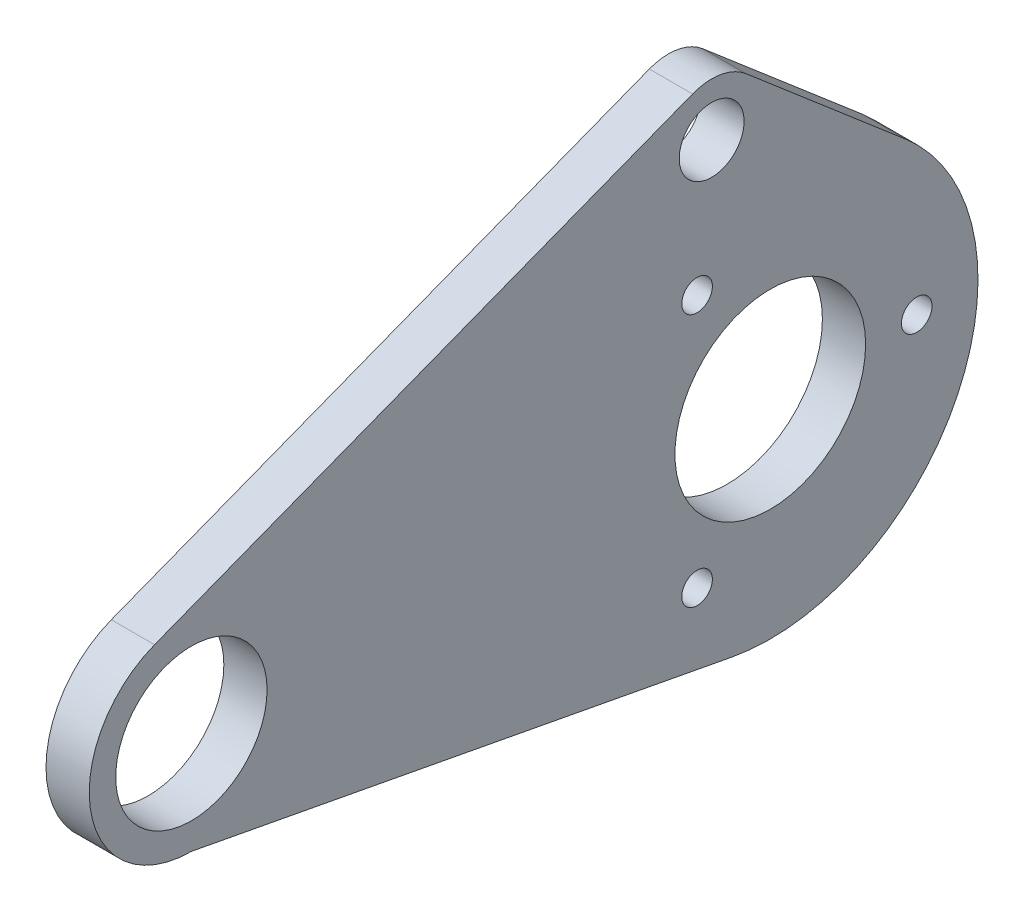
ISO-10303-21;
HEADER;
FILE_DESCRIPTION(('STEP AP214'),'2;1');
FILE_NAME('part.step','',(''),(''),'','','');
FILE_SCHEMA(('AUTOMOTIVE_DESIGN { 1 0 10303 214 1 1 1 1 }'));
ENDSEC;
DATA;
#1=APPLICATION_CONTEXT('core data for automotive mechanical design processes');
#2=APPLICATION_PROTOCOL_DEFINITION('international standard','automotive_design',2000,#1);
#3=PRODUCT_CONTEXT('',#1,'mechanical');
#4=PRODUCT('Part','Part','',(#3));
#5=PRODUCT_RELATED_PRODUCT_CATEGORY('part','',(#4));
#6=PRODUCT_DEFINITION_FORMATION('','',#4);
#7=PRODUCT_DEFINITION_CONTEXT('part definition',#1,'design');
#8=PRODUCT_DEFINITION('design','',#6,#7);
#9=PRODUCT_DEFINITION_SHAPE('','',#8);
#10=(LENGTH_UNIT() NAMED_UNIT(*) SI_UNIT(.MILLI.,.METRE.));
#11=(NAMED_UNIT(*) PLANE_ANGLE_UNIT() SI_UNIT($,.RADIAN.));
#12=(NAMED_UNIT(*) SI_UNIT($,.STERADIAN.) SOLID_ANGLE_UNIT());
#13=UNCERTAINTY_MEASURE_WITH_UNIT(LENGTH_MEASURE(1.E-05),#10,'distance_accuracy_value','');
#14=(GEOMETRIC_REPRESENTATION_CONTEXT(3) GLOBAL_UNCERTAINTY_ASSIGNED_CONTEXT((#13)) GLOBAL_UNIT_ASSIGNED_CONTEXT((#10,
#11,#12)) REPRESENTATION_CONTEXT('',''));
#15=CARTESIAN_POINT('',(0.,0.,0.));
#16=DIRECTION('',(0.,0.,1.));
#17=DIRECTION('',(1.,0.,0.));
#18=AXIS2_PLACEMENT_3D('',#15,#16,#17);
#19=CARTESIAN_POINT('',(3.175,65.16528566238,-55.7225276470214));
#20=DIRECTION('',(0.,-0.760025026253315,0.64989380630119));
#21=DIRECTION('',(0.,-0.64989380630119,-0.760025026253315));
#22=AXIS2_PLACEMENT_3D('',#19,#20,#21);
#23=PLANE('',#22);
#24=DIRECTION('',(0.,0.64989380630119,0.760025026253315));
#25=VECTOR('',#24,1.);
#26=CARTESIAN_POINT('',(-3.175,65.16528566238,-55.7225276470214));
#27=LINE('',#26,#25);
#28=CARTESIAN_POINT('',(-3.175,23.1807633007261,-104.821761092186));
#29=VERTEX_POINT('',#28);
#30=CARTESIAN_POINT('',(-3.175,43.1804466648645,-81.4329247522953));
#31=VERTEX_POINT('',#30);
#32=EDGE_CURVE('E129',#29,#31,#27,.T.);
#33=ORIENTED_EDGE('',*,*,#32,.T.);
#34=DIRECTION('',(-1.,0.,0.));
#35=VECTOR('',#34,1.);
#36=CARTESIAN_POINT('',(3.175,43.1804466648645,-81.4329247522953));
#37=LINE('',#36,#35);
#38=CARTESIAN_POINT('',(3.175,43.1804466648645,-81.4329247522953));
#39=VERTEX_POINT('',#38);
#40=EDGE_CURVE('E11',#39,#31,#37,.T.);
#41=ORIENTED_EDGE('',*,*,#40,.F.);
#42=DIRECTION('',(0.,0.64989380630119,0.760025026253315));
#43=VECTOR('',#42,1.);
#44=CARTESIAN_POINT('',(3.175,65.16528566238,-55.7225276470214));
#45=LINE('',#44,#43);
#46=CARTESIAN_POINT('',(3.175,23.1807633007261,-104.821761092186));
#47=VERTEX_POINT('',#46);
#48=EDGE_CURVE('E149',#47,#39,#45,.T.);
#49=ORIENTED_EDGE('',*,*,#48,.F.);
#50=DIRECTION('',(-1.,0.,0.));
#51=VECTOR('',#50,1.);
#52=CARTESIAN_POINT('',(3.175,23.1807633007261,-104.821761092186));
#53=LINE('',#52,#51);
#54=EDGE_CURVE('E128',#47,#29,#53,.T.);
#55=ORIENTED_EDGE('',*,*,#54,.T.);
#56=EDGE_LOOP('',(#33,#41,#49,#55));
#57=FACE_BOUND('',#56,.T.);
#58=ADVANCED_FACE('F35',(#57),#23,.F.);
#59=CARTESIAN_POINT('',(3.175,37.2807523985732,-76.3881240808824));
#60=DIRECTION('',(-1.,0.,0.));
#61=DIRECTION('',(0.,0.,1.));
#62=AXIS2_PLACEMENT_3D('',#59,#60,#61);
#63=CYLINDRICAL_SURFACE('',#62,7.76249999999999);
#64=CARTESIAN_POINT('',(-3.175,37.2807523985732,-76.3881240808824));
#65=DIRECTION('',(1.,0.,0.));
#66=DIRECTION('',(0.,0.,-1.));
#67=AXIS2_PLACEMENT_3D('',#64,#65,#66);
#68=CIRCLE('',#67,7.76249999999999);
#69=CARTESIAN_POINT('',(-3.175,44.5213438158952,-73.5898670917189));
#70=VERTEX_POINT('',#69);
#71=EDGE_CURVE('E132',#31,#70,#68,.T.);
#72=ORIENTED_EDGE('',*,*,#71,.T.);
#73=DIRECTION('',(-1.,0.,0.));
#74=VECTOR('',#73,1.);
#75=CARTESIAN_POINT('',(3.175,44.5213438158952,-73.5898670917189));
#76=LINE('',#75,#74);
#77=CARTESIAN_POINT('',(3.175,44.5213438158952,-73.5898670917189));
#78=VERTEX_POINT('',#77);
#79=EDGE_CURVE('E43',#78,#70,#76,.T.);
#80=ORIENTED_EDGE('',*,*,#79,.F.);
#81=CARTESIAN_POINT('',(3.175,37.2807523985732,-76.3881240808824));
#82=DIRECTION('',(1.,0.,0.));
#83=DIRECTION('',(0.,0.,-1.));
#84=AXIS2_PLACEMENT_3D('',#81,#82,#83);
#85=CIRCLE('',#84,7.76249999999999);
#86=EDGE_CURVE('E88',#39,#78,#85,.T.);
#87=ORIENTED_EDGE('',*,*,#86,.F.);
#88=ORIENTED_EDGE('',*,*,#40,.T.);
#89=EDGE_LOOP('',(#72,#80,#87,#88));
#90=FACE_BOUND('',#89,.T.);
#91=ADVANCED_FACE('F179',(#90),#63,.T.);
#92=CARTESIAN_POINT('',(3.175,13.9914809996561,5.40725988244154));
#93=DIRECTION('',(0.,-0.932765399977075,-0.360483992162769));
#94=DIRECTION('',(0.,0.360483992162769,-0.932765399977075));
#95=AXIS2_PLACEMENT_3D('',#92,#93,#94);
#96=PLANE('',#95);
#97=DIRECTION('',(0.,-0.360483992162769,0.932765399977075));
#98=VECTOR('',#97,1.);
#99=CARTESIAN_POINT('',(-3.175,13.9914809996561,5.40725988244154));
#100=LINE('',#99,#98);
#101=CARTESIAN_POINT('',(-3.175,13.9914809996561,5.40725988244153));
#102=VERTEX_POINT('',#101);
#103=EDGE_CURVE('E135',#70,#102,#100,.T.);
#104=ORIENTED_EDGE('',*,*,#103,.T.);
#105=DIRECTION('',(-1.,0.,0.));
#106=VECTOR('',#105,1.);
#107=CARTESIAN_POINT('',(3.175,13.9914809996561,5.40725988244153));
#108=LINE('',#107,#106);
#109=CARTESIAN_POINT('',(3.175,13.9914809996561,5.40725988244153));
#110=VERTEX_POINT('',#109);
#111=EDGE_CURVE('E111',#110,#102,#108,.T.);
#112=ORIENTED_EDGE('',*,*,#111,.F.);
#113=DIRECTION('',(0.,-0.360483992162769,0.932765399977075));
#114=VECTOR('',#113,1.);
#115=CARTESIAN_POINT('',(3.175,13.9914809996561,5.40725988244154));
#116=LINE('',#115,#114);
#117=EDGE_CURVE('E102',#78,#110,#116,.T.);
#118=ORIENTED_EDGE('',*,*,#117,.F.);
#119=ORIENTED_EDGE('',*,*,#79,.T.);
#120=EDGE_LOOP('',(#104,#112,#118,#119));
#121=FACE_BOUND('',#120,.T.);
#122=ADVANCED_FACE('F155',(#121),#96,.F.);
#123=CARTESIAN_POINT('',(3.175,0.,0.));
#124=DIRECTION('',(-1.,0.,0.));
#125=DIRECTION('',(0.,0.,1.));
#126=AXIS2_PLACEMENT_3D('',#123,#124,#125);
#127=CYLINDRICAL_SURFACE('',#126,15.);
#128=CARTESIAN_POINT('',(-3.175,0.,0.));
#129=DIRECTION('',(1.,0.,0.));
#130=DIRECTION('',(0.,0.,-1.));
#131=AXIS2_PLACEMENT_3D('',#128,#129,#130);
#132=CIRCLE('',#131,15.);
#133=CARTESIAN_POINT('',(-3.175,-15.,0.));
#134=VERTEX_POINT('',#133);
#135=EDGE_CURVE('E110',#102,#134,#132,.T.);
#136=ORIENTED_EDGE('',*,*,#135,.T.);
#137=DIRECTION('',(-1.,0.,0.));
#138=VECTOR('',#137,1.);
#139=CARTESIAN_POINT('',(3.175,-15.,0.));
#140=LINE('',#139,#138);
#141=CARTESIAN_POINT('',(3.175,-15.,0.));
#142=VERTEX_POINT('',#141);
#143=EDGE_CURVE('E107',#142,#134,#140,.T.);
#144=ORIENTED_EDGE('',*,*,#143,.F.);
#145=CARTESIAN_POINT('',(3.175,0.,0.));
#146=DIRECTION('',(1.,0.,0.));
#147=DIRECTION('',(0.,0.,-1.));
#148=AXIS2_PLACEMENT_3D('',#145,#146,#147);
#149=CIRCLE('',#148,15.);
#150=EDGE_CURVE('E95',#110,#142,#149,.T.);
#151=ORIENTED_EDGE('',*,*,#150,.F.);
#152=ORIENTED_EDGE('',*,*,#111,.T.);
#153=EDGE_LOOP('',(#136,#144,#151,#152));
#154=FACE_BOUND('',#153,.T.);
#155=ADVANCED_FACE('F108',(#154),#127,.T.);
#156=CARTESIAN_POINT('',(3.175,-14.4843313242418,2.732968341056));
#157=DIRECTION('',(0.,0.982660718805218,-0.185412814328491));
#158=DIRECTION('',(0.,0.185412814328491,0.982660718805219));
#159=AXIS2_PLACEMENT_3D('',#156,#157,#158);
#160=PLANE('',#159);
#161=DIRECTION('',(0.,-0.185412814328491,-0.982660718805219));
#162=VECTOR('',#161,1.);
#163=CARTESIAN_POINT('',(-3.175,-14.4843313242418,2.732968341056));
#164=LINE('',#163,#162);
#165=CARTESIAN_POINT('',(-3.175,-29.9711519235592,-79.344909162981));
#166=VERTEX_POINT('',#165);
#167=EDGE_CURVE('E74',#134,#166,#164,.T.);
#168=ORIENTED_EDGE('',*,*,#167,.T.);
#169=DIRECTION('',(-1.,0.,0.));
#170=VECTOR('',#169,1.);
#171=CARTESIAN_POINT('',(3.175,-29.9711519235592,-79.344909162981));
#172=LINE('',#171,#170);
#173=CARTESIAN_POINT('',(3.175,-29.9711519235592,-79.344909162981));
#174=VERTEX_POINT('',#173);
#175=EDGE_CURVE('E112',#174,#166,#172,.T.);
#176=ORIENTED_EDGE('',*,*,#175,.F.);
#177=DIRECTION('',(0.,-0.185412814328491,-0.982660718805219));
#178=VECTOR('',#177,1.);
#179=CARTESIAN_POINT('',(3.175,-14.4843313242418,2.732968341056));
#180=LINE('',#179,#178);
#181=EDGE_CURVE('E100',#142,#174,#180,.T.);
#182=ORIENTED_EDGE('',*,*,#181,.F.);
#183=ORIENTED_EDGE('',*,*,#143,.T.);
#184=EDGE_LOOP('',(#168,#176,#182,#183));
#185=FACE_BOUND('',#184,.T.);
#186=ADVANCED_FACE('F114',(#185),#160,.F.);
#187=CARTESIAN_POINT('',(3.175,0.,0.));
#188=DIRECTION('',(-1.,0.,0.));
#189=DIRECTION('',(0.,0.,1.));
#190=AXIS2_PLACEMENT_3D('',#187,#188,#189);
#191=CYLINDRICAL_SURFACE('',#190,11.1125);
#192=CARTESIAN_POINT('',(3.175,0.,0.));
#193=DIRECTION('',(1.,0.,0.));
#194=DIRECTION('',(0.,0.,-1.));
#195=AXIS2_PLACEMENT_3D('',#192,#193,#194);
#196=CIRCLE('',#195,11.1125);
#197=CARTESIAN_POINT('',(3.175,0.,-11.1125));
#198=VERTEX_POINT('',#197);
#199=EDGE_CURVE('E122',#198,#198,#196,.T.);
#200=ORIENTED_EDGE('',*,*,#199,.T.);
#201=EDGE_LOOP('',(#200));
#202=FACE_BOUND('',#201,.T.);
#203=CARTESIAN_POINT('',(-3.175,0.,0.));
#204=DIRECTION('',(1.,0.,0.));
#205=DIRECTION('',(0.,0.,-1.));
#206=AXIS2_PLACEMENT_3D('',#203,#204,#205);
#207=CIRCLE('',#206,11.1125);
#208=CARTESIAN_POINT('',(-3.175,0.,-11.1125));
#209=VERTEX_POINT('',#208);
#210=EDGE_CURVE('E143',#209,#209,#207,.T.);
#211=ORIENTED_EDGE('',*,*,#210,.F.);
#212=EDGE_LOOP('',(#211));
#213=FACE_BOUND('',#212,.T.);
#214=ADVANCED_FACE('F174',(#202,#213),#191,.F.);
#215=CARTESIAN_POINT('',(3.175,0.,-85.));
#216=DIRECTION('',(-1.,0.,0.));
#217=DIRECTION('',(0.,0.,1.));
#218=AXIS2_PLACEMENT_3D('',#215,#216,#217);
#219=CYLINDRICAL_SURFACE('',#218,14.);
#220=CARTESIAN_POINT('',(3.175,0.,-85.));
#221=DIRECTION('',(1.,0.,0.));
#222=DIRECTION('',(0.,0.,-1.));
#223=AXIS2_PLACEMENT_3D('',#220,#221,#222);
#224=CIRCLE('',#223,14.);
#225=CARTESIAN_POINT('',(3.175,0.,-99.));
#226=VERTEX_POINT('',#225);
#227=EDGE_CURVE('E116',#226,#226,#224,.T.);
#228=ORIENTED_EDGE('',*,*,#227,.T.);
#229=EDGE_LOOP('',(#228));
#230=FACE_BOUND('',#229,.T.);
#231=CARTESIAN_POINT('',(-3.175,0.,-85.));
#232=DIRECTION('',(1.,0.,0.));
#233=DIRECTION('',(0.,0.,-1.));
#234=AXIS2_PLACEMENT_3D('',#231,#232,#233);
#235=CIRCLE('',#234,14.);
#236=CARTESIAN_POINT('',(-3.175,0.,-99.));
#237=VERTEX_POINT('',#236);
#238=EDGE_CURVE('E140',#237,#237,#235,.T.);
#239=ORIENTED_EDGE('',*,*,#238,.F.);
#240=EDGE_LOOP('',(#239));
#241=FACE_BOUND('',#240,.T.);
#242=ADVANCED_FACE('F166',(#230,#241),#219,.F.);
#243=CARTESIAN_POINT('',(3.175,0.,-85.));
#244=DIRECTION('',(-1.,0.,0.));
#245=DIRECTION('',(0.,0.,1.));
#246=AXIS2_PLACEMENT_3D('',#243,#244,#245);
#247=CYLINDRICAL_SURFACE('',#246,30.5);
#248=CARTESIAN_POINT('',(-3.175,0.,-85.));
#249=DIRECTION('',(1.,0.,0.));
#250=DIRECTION('',(0.,0.,-1.));
#251=AXIS2_PLACEMENT_3D('',#248,#249,#250);
#252=CIRCLE('',#251,30.5);
#253=EDGE_CURVE('E80',#166,#29,#252,.T.);
#254=ORIENTED_EDGE('',*,*,#253,.T.);
#255=ORIENTED_EDGE('',*,*,#54,.F.);
#256=CARTESIAN_POINT('',(3.175,0.,-85.));
#257=DIRECTION('',(1.,0.,0.));
#258=DIRECTION('',(0.,0.,-1.));
#259=AXIS2_PLACEMENT_3D('',#256,#257,#258);
#260=CIRCLE('',#259,30.5);
#261=EDGE_CURVE('E51',#174,#47,#260,.T.);
#262=ORIENTED_EDGE('',*,*,#261,.F.);
#263=ORIENTED_EDGE('',*,*,#175,.T.);
#264=EDGE_LOOP('',(#254,#255,#262,#263));
#265=FACE_BOUND('',#264,.T.);
#266=ADVANCED_FACE('F163',(#265),#247,.T.);
#267=CARTESIAN_POINT('',(3.175,37.2807523985732,-76.3881240808824));
#268=DIRECTION('',(-1.,0.,0.));
#269=DIRECTION('',(0.,0.,1.));
#270=AXIS2_PLACEMENT_3D('',#267,#268,#269);
#271=CYLINDRICAL_SURFACE('',#270,4.7625);
#272=CARTESIAN_POINT('',(3.175,37.2807523985732,-76.3881240808824));
#273=DIRECTION('',(1.,0.,0.));
#274=DIRECTION('',(0.,0.,-1.));
#275=AXIS2_PLACEMENT_3D('',#272,#273,#274);
#276=CIRCLE('',#275,4.7625);
#277=CARTESIAN_POINT('',(3.175,37.2807523985732,-81.1506240808824));
#278=VERTEX_POINT('',#277);
#279=EDGE_CURVE('E125',#278,#278,#276,.T.);
#280=ORIENTED_EDGE('',*,*,#279,.T.);
#281=EDGE_LOOP('',(#280));
#282=FACE_BOUND('',#281,.T.);
#283=CARTESIAN_POINT('',(-3.175,37.2807523985732,-76.3881240808824));
#284=DIRECTION('',(1.,0.,0.));
#285=DIRECTION('',(0.,0.,-1.));
#286=AXIS2_PLACEMENT_3D('',#283,#284,#285);
#287=CIRCLE('',#286,4.7625);
#288=CARTESIAN_POINT('',(-3.175,37.2807523985732,-81.1506240808824));
#289=VERTEX_POINT('',#288);
#290=EDGE_CURVE('E146',#289,#289,#287,.T.);
#291=ORIENTED_EDGE('',*,*,#290,.F.);
#292=EDGE_LOOP('',(#291));
#293=FACE_BOUND('',#292,.T.);
#294=ADVANCED_FACE('F165',(#282,#293),#271,.F.);
#295=CARTESIAN_POINT('',(3.175,0.,0.));
#296=DIRECTION('',(1.,0.,0.));
#297=DIRECTION('',(0.,0.,-1.));
#298=AXIS2_PLACEMENT_3D('',#295,#296,#297);
#299=PLANE('',#298);
#300=CARTESIAN_POINT('',(3.175,0.,-106.5));
#301=DIRECTION('',(1.,0.,0.));
#302=DIRECTION('',(0.,0.,-1.));
#303=AXIS2_PLACEMENT_3D('',#300,#301,#302);
#304=CIRCLE('',#303,2.25);
#305=CARTESIAN_POINT('',(3.175,0.,-108.75));
#306=VERTEX_POINT('',#305);
#307=EDGE_CURVE('E224',#306,#306,#304,.T.);
#308=ORIENTED_EDGE('',*,*,#307,.F.);
#309=EDGE_LOOP('',(#308));
#310=FACE_BOUND('',#309,.T.);
#311=CARTESIAN_POINT('',(3.175,-18.6195461813654,-74.25));
#312=DIRECTION('',(1.,0.,0.));
#313=DIRECTION('',(0.,0.,-1.));
#314=AXIS2_PLACEMENT_3D('',#311,#312,#313);
#315=CIRCLE('',#314,2.25);
#316=CARTESIAN_POINT('',(3.175,-18.6195461813654,-76.5));
#317=VERTEX_POINT('',#316);
#318=EDGE_CURVE('E226',#317,#317,#315,.T.);
#319=ORIENTED_EDGE('',*,*,#318,.F.);
#320=EDGE_LOOP('',(#319));
#321=FACE_BOUND('',#320,.T.);
#322=CARTESIAN_POINT('',(3.175,18.6195461813655,-74.25));
#323=DIRECTION('',(1.,0.,0.));
#324=DIRECTION('',(0.,0.,-1.));
#325=AXIS2_PLACEMENT_3D('',#322,#323,#324);
#326=CIRCLE('',#325,2.25);
#327=CARTESIAN_POINT('',(3.175,18.6195461813655,-76.5));
#328=VERTEX_POINT('',#327);
#329=EDGE_CURVE('E234',#328,#328,#326,.T.);
#330=ORIENTED_EDGE('',*,*,#329,.F.);
#331=EDGE_LOOP('',(#330));
#332=FACE_BOUND('',#331,.T.);
#333=ORIENTED_EDGE('',*,*,#48,.T.);
#334=ORIENTED_EDGE('',*,*,#86,.T.);
#335=ORIENTED_EDGE('',*,*,#117,.T.);
#336=ORIENTED_EDGE('',*,*,#150,.T.);
#337=ORIENTED_EDGE('',*,*,#181,.T.);
#338=ORIENTED_EDGE('',*,*,#261,.T.);
#339=EDGE_LOOP('',(#333,#334,#335,#336,#337,#338));
#340=FACE_BOUND('',#339,.T.);
#341=ORIENTED_EDGE('',*,*,#227,.F.);
#342=EDGE_LOOP('',(#341));
#343=FACE_BOUND('',#342,.T.);
#344=ORIENTED_EDGE('',*,*,#199,.F.);
#345=EDGE_LOOP('',(#344));
#346=FACE_BOUND('',#345,.T.);
#347=ORIENTED_EDGE('',*,*,#279,.F.);
#348=EDGE_LOOP('',(#347));
#349=FACE_BOUND('',#348,.T.);
#350=ADVANCED_FACE('F97',(#310,#321,#332,#340,#343,#346,#349),#299,.T.);
#351=CARTESIAN_POINT('',(-3.175,0.,0.));
#352=DIRECTION('',(1.,0.,0.));
#353=DIRECTION('',(0.,0.,-1.));
#354=AXIS2_PLACEMENT_3D('',#351,#352,#353);
#355=PLANE('',#354);
#356=CARTESIAN_POINT('',(-3.175,0.,-106.5));
#357=DIRECTION('',(1.,0.,0.));
#358=DIRECTION('',(0.,0.,-1.));
#359=AXIS2_PLACEMENT_3D('',#356,#357,#358);
#360=CIRCLE('',#359,2.25);
#361=CARTESIAN_POINT('',(-3.175,0.,-108.75));
#362=VERTEX_POINT('',#361);
#363=EDGE_CURVE('E221',#362,#362,#360,.T.);
#364=ORIENTED_EDGE('',*,*,#363,.T.);
#365=EDGE_LOOP('',(#364));
#366=FACE_BOUND('',#365,.T.);
#367=CARTESIAN_POINT('',(-3.175,-18.6195461813654,-74.25));
#368=DIRECTION('',(1.,0.,0.));
#369=DIRECTION('',(0.,0.,-1.));
#370=AXIS2_PLACEMENT_3D('',#367,#368,#369);
#371=CIRCLE('',#370,2.25);
#372=CARTESIAN_POINT('',(-3.175,-18.6195461813654,-76.5));
#373=VERTEX_POINT('',#372);
#374=EDGE_CURVE('E231',#373,#373,#371,.T.);
#375=ORIENTED_EDGE('',*,*,#374,.T.);
#376=EDGE_LOOP('',(#375));
#377=FACE_BOUND('',#376,.T.);
#378=CARTESIAN_POINT('',(-3.175,18.6195461813655,-74.25));
#379=DIRECTION('',(1.,0.,0.));
#380=DIRECTION('',(0.,0.,-1.));
#381=AXIS2_PLACEMENT_3D('',#378,#379,#380);
#382=CIRCLE('',#381,2.25);
#383=CARTESIAN_POINT('',(-3.175,18.6195461813655,-76.5));
#384=VERTEX_POINT('',#383);
#385=EDGE_CURVE('E133',#384,#384,#382,.T.);
#386=ORIENTED_EDGE('',*,*,#385,.T.);
#387=EDGE_LOOP('',(#386));
#388=FACE_BOUND('',#387,.T.);
#389=ORIENTED_EDGE('',*,*,#32,.F.);
#390=ORIENTED_EDGE('',*,*,#253,.F.);
#391=ORIENTED_EDGE('',*,*,#167,.F.);
#392=ORIENTED_EDGE('',*,*,#135,.F.);
#393=ORIENTED_EDGE('',*,*,#103,.F.);
#394=ORIENTED_EDGE('',*,*,#71,.F.);
#395=EDGE_LOOP('',(#389,#390,#391,#392,#393,#394));
#396=FACE_BOUND('',#395,.T.);
#397=ORIENTED_EDGE('',*,*,#238,.T.);
#398=EDGE_LOOP('',(#397));
#399=FACE_BOUND('',#398,.T.);
#400=ORIENTED_EDGE('',*,*,#210,.T.);
#401=EDGE_LOOP('',(#400));
#402=FACE_BOUND('',#401,.T.);
#403=ORIENTED_EDGE('',*,*,#290,.T.);
#404=EDGE_LOOP('',(#403));
#405=FACE_BOUND('',#404,.T.);
#406=ADVANCED_FACE('F158',(#366,#377,#388,#396,#399,#402,#405),#355,.F.);
#407=CARTESIAN_POINT('',(3.175,18.6195461813655,-74.25));
#408=DIRECTION('',(1.,0.,0.));
#409=DIRECTION('',(0.,0.,-1.));
#410=AXIS2_PLACEMENT_3D('',#407,#408,#409);
#411=CYLINDRICAL_SURFACE('',#410,2.25);
#412=ORIENTED_EDGE('',*,*,#385,.F.);
#413=EDGE_LOOP('',(#412));
#414=FACE_BOUND('',#413,.T.);
#415=ORIENTED_EDGE('',*,*,#329,.T.);
#416=EDGE_LOOP('',(#415));
#417=FACE_BOUND('',#416,.T.);
#418=ADVANCED_FACE('F201',(#414,#417),#411,.F.);
#419=CARTESIAN_POINT('',(3.175,-18.6195461813654,-74.25));
#420=DIRECTION('',(1.,0.,0.));
#421=DIRECTION('',(0.,0.,-1.));
#422=AXIS2_PLACEMENT_3D('',#419,#420,#421);
#423=CYLINDRICAL_SURFACE('',#422,2.25);
#424=ORIENTED_EDGE('',*,*,#374,.F.);
#425=EDGE_LOOP('',(#424));
#426=FACE_BOUND('',#425,.T.);
#427=ORIENTED_EDGE('',*,*,#318,.T.);
#428=EDGE_LOOP('',(#427));
#429=FACE_BOUND('',#428,.T.);
#430=ADVANCED_FACE('F208',(#426,#429),#423,.F.);
#431=CARTESIAN_POINT('',(3.175,0.,-106.5));
#432=DIRECTION('',(1.,0.,0.));
#433=DIRECTION('',(0.,0.,-1.));
#434=AXIS2_PLACEMENT_3D('',#431,#432,#433);
#435=CYLINDRICAL_SURFACE('',#434,2.25);
#436=ORIENTED_EDGE('',*,*,#363,.F.);
#437=EDGE_LOOP('',(#436));
#438=FACE_BOUND('',#437,.T.);
#439=ORIENTED_EDGE('',*,*,#307,.T.);
#440=EDGE_LOOP('',(#439));
#441=FACE_BOUND('',#440,.T.);
#442=ADVANCED_FACE('F212',(#438,#441),#435,.F.);
#443=CLOSED_SHELL('',(#58,#91,#122,#155,#186,#214,#242,#266,#294,#350,#406,#418,#430,#442));
#444=MANIFOLD_SOLID_BREP('B2',#443);
#445=ADVANCED_BREP_SHAPE_REPRESENTATION('',(#18,#444),#14);
#446=SHAPE_DEFINITION_REPRESENTATION(#9,#445);
ENDSEC;
END-ISO-10303-21;
